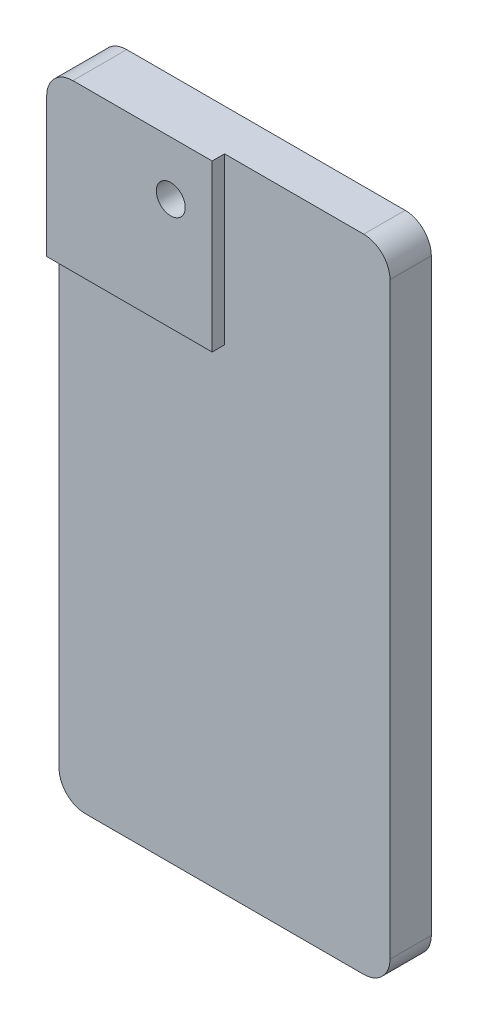
ISO-10303-21;
HEADER;
FILE_DESCRIPTION(('STEP AP214'),'2;1');
FILE_NAME('part.step','',(''),(''),'','','');
FILE_SCHEMA(('AUTOMOTIVE_DESIGN { 1 0 10303 214 1 1 1 1 }'));
ENDSEC;
DATA;
#1=APPLICATION_CONTEXT('core data for automotive mechanical design processes');
#2=APPLICATION_PROTOCOL_DEFINITION('international standard','automotive_design',2000,#1);
#3=PRODUCT_CONTEXT('',#1,'mechanical');
#4=PRODUCT('Part','Part','',(#3));
#5=PRODUCT_RELATED_PRODUCT_CATEGORY('part','',(#4));
#6=PRODUCT_DEFINITION_FORMATION('','',#4);
#7=PRODUCT_DEFINITION_CONTEXT('part definition',#1,'design');
#8=PRODUCT_DEFINITION('design','',#6,#7);
#9=PRODUCT_DEFINITION_SHAPE('','',#8);
#10=(LENGTH_UNIT() NAMED_UNIT(*) SI_UNIT(.MILLI.,.METRE.));
#11=(NAMED_UNIT(*) PLANE_ANGLE_UNIT() SI_UNIT($,.RADIAN.));
#12=(NAMED_UNIT(*) SI_UNIT($,.STERADIAN.) SOLID_ANGLE_UNIT());
#13=UNCERTAINTY_MEASURE_WITH_UNIT(LENGTH_MEASURE(1.E-05),#10,'distance_accuracy_value','');
#14=(GEOMETRIC_REPRESENTATION_CONTEXT(3) GLOBAL_UNCERTAINTY_ASSIGNED_CONTEXT((#13)) GLOBAL_UNIT_ASSIGNED_CONTEXT((#10,
#11,#12)) REPRESENTATION_CONTEXT('',''));
#15=CARTESIAN_POINT('',(0.,0.,0.));
#16=DIRECTION('',(0.,0.,1.));
#17=DIRECTION('',(1.,0.,0.));
#18=AXIS2_PLACEMENT_3D('',#15,#16,#17);
#19=CARTESIAN_POINT('',(40.,77.5,5.));
#20=DIRECTION('',(-1.,0.,0.));
#21=DIRECTION('',(0.,-1.,0.));
#22=AXIS2_PLACEMENT_3D('',#19,#20,#21);
#23=PLANE('',#22);
#24=DIRECTION('',(0.,1.,0.));
#25=VECTOR('',#24,1.);
#26=CARTESIAN_POINT('',(40.,77.5,5.));
#27=LINE('',#26,#25);
#28=CARTESIAN_POINT('',(40.,-71.15,5.));
#29=VERTEX_POINT('',#28);
#30=CARTESIAN_POINT('',(40.,71.15,5.));
#31=VERTEX_POINT('',#30);
#32=EDGE_CURVE('E165',#29,#31,#27,.T.);
#33=ORIENTED_EDGE('',*,*,#32,.F.);
#34=DIRECTION('',(0.,0.,-1.));
#35=VECTOR('',#34,1.);
#36=CARTESIAN_POINT('',(40.,-71.15,5.));
#37=LINE('',#36,#35);
#38=CARTESIAN_POINT('',(40.,-71.15,-5.));
#39=VERTEX_POINT('',#38);
#40=EDGE_CURVE('E190',#29,#39,#37,.T.);
#41=ORIENTED_EDGE('',*,*,#40,.T.);
#42=DIRECTION('',(0.,1.,0.));
#43=VECTOR('',#42,1.);
#44=CARTESIAN_POINT('',(40.,77.5,-5.));
#45=LINE('',#44,#43);
#46=CARTESIAN_POINT('',(40.,71.15,-5.));
#47=VERTEX_POINT('',#46);
#48=EDGE_CURVE('E154',#39,#47,#45,.T.);
#49=ORIENTED_EDGE('',*,*,#48,.T.);
#50=DIRECTION('',(0.,0.,-1.));
#51=VECTOR('',#50,1.);
#52=CARTESIAN_POINT('',(40.,71.15,5.));
#53=LINE('',#52,#51);
#54=EDGE_CURVE('E178',#47,#31,#53,.F.);
#55=ORIENTED_EDGE('',*,*,#54,.T.);
#56=EDGE_LOOP('',(#33,#41,#49,#55));
#57=FACE_BOUND('',#56,.T.);
#58=ADVANCED_FACE('F44',(#57),#23,.F.);
#59=CARTESIAN_POINT('',(-40.,77.5,5.));
#60=DIRECTION('',(0.,-1.,0.));
#61=DIRECTION('',(0.,0.,-1.));
#62=AXIS2_PLACEMENT_3D('',#59,#60,#61);
#63=PLANE('',#62);
#64=DIRECTION('',(-1.,0.,0.));
#65=VECTOR('',#64,1.);
#66=CARTESIAN_POINT('',(-40.,77.5,5.));
#67=LINE('',#66,#65);
#68=CARTESIAN_POINT('',(33.65,77.5,5.));
#69=VERTEX_POINT('',#68);
#70=CARTESIAN_POINT('',(0.,77.5,5.));
#71=VERTEX_POINT('',#70);
#72=EDGE_CURVE('E169',#69,#71,#67,.T.);
#73=ORIENTED_EDGE('',*,*,#72,.F.);
#74=DIRECTION('',(0.,0.,-1.));
#75=VECTOR('',#74,1.);
#76=CARTESIAN_POINT('',(33.65,77.5,5.));
#77=LINE('',#76,#75);
#78=CARTESIAN_POINT('',(33.65,77.5,-5.));
#79=VERTEX_POINT('',#78);
#80=EDGE_CURVE('E53',#69,#79,#77,.T.);
#81=ORIENTED_EDGE('',*,*,#80,.T.);
#82=DIRECTION('',(-1.,0.,0.));
#83=VECTOR('',#82,1.);
#84=CARTESIAN_POINT('',(-40.,77.5,-5.));
#85=LINE('',#84,#83);
#86=CARTESIAN_POINT('',(-33.65,77.5,-5.));
#87=VERTEX_POINT('',#86);
#88=EDGE_CURVE('E159',#79,#87,#85,.T.);
#89=ORIENTED_EDGE('',*,*,#88,.T.);
#90=DIRECTION('',(0.,0.,-1.));
#91=VECTOR('',#90,1.);
#92=CARTESIAN_POINT('',(-33.65,77.5,5.));
#93=LINE('',#92,#91);
#94=CARTESIAN_POINT('',(-33.65,77.5,8.));
#95=VERTEX_POINT('',#94);
#96=EDGE_CURVE('E60',#87,#95,#93,.F.);
#97=ORIENTED_EDGE('',*,*,#96,.T.);
#98=DIRECTION('',(-1.,0.,0.));
#99=VECTOR('',#98,1.);
#100=CARTESIAN_POINT('',(-40.,77.5,8.));
#101=LINE('',#100,#99);
#102=CARTESIAN_POINT('',(0.,77.5,8.));
#103=VERTEX_POINT('',#102);
#104=EDGE_CURVE('E270',#103,#95,#101,.T.);
#105=ORIENTED_EDGE('',*,*,#104,.F.);
#106=DIRECTION('',(0.,0.,-1.));
#107=VECTOR('',#106,1.);
#108=CARTESIAN_POINT('',(0.,77.5,8.));
#109=LINE('',#108,#107);
#110=EDGE_CURVE('E161',#103,#71,#109,.T.);
#111=ORIENTED_EDGE('',*,*,#110,.T.);
#112=EDGE_LOOP('',(#73,#81,#89,#97,#105,#111));
#113=FACE_BOUND('',#112,.T.);
#114=ADVANCED_FACE('F234',(#113),#63,.F.);
#115=CARTESIAN_POINT('',(-40.,77.5,5.));
#116=DIRECTION('',(1.,0.,0.));
#117=DIRECTION('',(0.,1.,0.));
#118=AXIS2_PLACEMENT_3D('',#115,#116,#117);
#119=PLANE('',#118);
#120=DIRECTION('',(0.,-1.,0.));
#121=VECTOR('',#120,1.);
#122=CARTESIAN_POINT('',(-40.,77.5,-5.));
#123=LINE('',#122,#121);
#124=CARTESIAN_POINT('',(-40.,71.15,-5.));
#125=VERTEX_POINT('',#124);
#126=CARTESIAN_POINT('',(-40.,-71.15,-5.));
#127=VERTEX_POINT('',#126);
#128=EDGE_CURVE('E182',#125,#127,#123,.T.);
#129=ORIENTED_EDGE('',*,*,#128,.T.);
#130=DIRECTION('',(0.,0.,-1.));
#131=VECTOR('',#130,1.);
#132=CARTESIAN_POINT('',(-40.,-71.15,5.));
#133=LINE('',#132,#131);
#134=CARTESIAN_POINT('',(-40.,-71.15,5.));
#135=VERTEX_POINT('',#134);
#136=EDGE_CURVE('E225',#127,#135,#133,.F.);
#137=ORIENTED_EDGE('',*,*,#136,.T.);
#138=DIRECTION('',(0.,-1.,0.));
#139=VECTOR('',#138,1.);
#140=CARTESIAN_POINT('',(-40.,77.5,5.));
#141=LINE('',#140,#139);
#142=CARTESIAN_POINT('',(-40.,37.5,5.));
#143=VERTEX_POINT('',#142);
#144=EDGE_CURVE('E152',#143,#135,#141,.T.);
#145=ORIENTED_EDGE('',*,*,#144,.F.);
#146=DIRECTION('',(0.,0.,-1.));
#147=VECTOR('',#146,1.);
#148=CARTESIAN_POINT('',(-40.,37.5,8.));
#149=LINE('',#148,#147);
#150=CARTESIAN_POINT('',(-40.,37.5,8.));
#151=VERTEX_POINT('',#150);
#152=EDGE_CURVE('E141',#151,#143,#149,.T.);
#153=ORIENTED_EDGE('',*,*,#152,.F.);
#154=DIRECTION('',(0.,-1.,0.));
#155=VECTOR('',#154,1.);
#156=CARTESIAN_POINT('',(-40.,77.5,8.));
#157=LINE('',#156,#155);
#158=CARTESIAN_POINT('',(-40.,71.15,8.));
#159=VERTEX_POINT('',#158);
#160=EDGE_CURVE('E125',#159,#151,#157,.T.);
#161=ORIENTED_EDGE('',*,*,#160,.F.);
#162=DIRECTION('',(0.,0.,-1.));
#163=VECTOR('',#162,1.);
#164=CARTESIAN_POINT('',(-40.,71.15,5.));
#165=LINE('',#164,#163);
#166=EDGE_CURVE('E222',#159,#125,#165,.T.);
#167=ORIENTED_EDGE('',*,*,#166,.T.);
#168=EDGE_LOOP('',(#129,#137,#145,#153,#161,#167));
#169=FACE_BOUND('',#168,.T.);
#170=ADVANCED_FACE('F150',(#169),#119,.F.);
#171=CARTESIAN_POINT('',(-40.,-77.5,5.));
#172=DIRECTION('',(0.,1.,0.));
#173=DIRECTION('',(0.,0.,1.));
#174=AXIS2_PLACEMENT_3D('',#171,#172,#173);
#175=PLANE('',#174);
#176=DIRECTION('',(1.,0.,0.));
#177=VECTOR('',#176,1.);
#178=CARTESIAN_POINT('',(-40.,-77.5,-5.));
#179=LINE('',#178,#177);
#180=CARTESIAN_POINT('',(-33.65,-77.5,-5.));
#181=VERTEX_POINT('',#180);
#182=CARTESIAN_POINT('',(33.65,-77.5,-5.));
#183=VERTEX_POINT('',#182);
#184=EDGE_CURVE('E170',#181,#183,#179,.T.);
#185=ORIENTED_EDGE('',*,*,#184,.T.);
#186=DIRECTION('',(0.,0.,-1.));
#187=VECTOR('',#186,1.);
#188=CARTESIAN_POINT('',(33.65,-77.5,5.));
#189=LINE('',#188,#187);
#190=CARTESIAN_POINT('',(33.65,-77.5,5.));
#191=VERTEX_POINT('',#190);
#192=EDGE_CURVE('E210',#183,#191,#189,.F.);
#193=ORIENTED_EDGE('',*,*,#192,.T.);
#194=DIRECTION('',(1.,0.,0.));
#195=VECTOR('',#194,1.);
#196=CARTESIAN_POINT('',(-40.,-77.5,5.));
#197=LINE('',#196,#195);
#198=CARTESIAN_POINT('',(-33.65,-77.5,5.));
#199=VERTEX_POINT('',#198);
#200=EDGE_CURVE('E175',#199,#191,#197,.T.);
#201=ORIENTED_EDGE('',*,*,#200,.F.);
#202=DIRECTION('',(0.,0.,-1.));
#203=VECTOR('',#202,1.);
#204=CARTESIAN_POINT('',(-33.65,-77.5,5.));
#205=LINE('',#204,#203);
#206=EDGE_CURVE('E206',#199,#181,#205,.T.);
#207=ORIENTED_EDGE('',*,*,#206,.T.);
#208=EDGE_LOOP('',(#185,#193,#201,#207));
#209=FACE_BOUND('',#208,.T.);
#210=ADVANCED_FACE('F253',(#209),#175,.F.);
#211=CARTESIAN_POINT('',(0.,0.,5.));
#212=DIRECTION('',(0.,0.,1.));
#213=DIRECTION('',(1.,0.,0.));
#214=AXIS2_PLACEMENT_3D('',#211,#212,#213);
#215=PLANE('',#214);
#216=ORIENTED_EDGE('',*,*,#200,.T.);
#217=CARTESIAN_POINT('',(33.65,-71.15,5.));
#218=DIRECTION('',(0.,0.,1.));
#219=DIRECTION('',(1.,0.,0.));
#220=AXIS2_PLACEMENT_3D('',#217,#218,#219);
#221=CIRCLE('',#220,6.35);
#222=EDGE_CURVE('E219',#191,#29,#221,.T.);
#223=ORIENTED_EDGE('',*,*,#222,.T.);
#224=ORIENTED_EDGE('',*,*,#32,.T.);
#225=CARTESIAN_POINT('',(33.65,71.15,5.));
#226=DIRECTION('',(0.,0.,1.));
#227=DIRECTION('',(1.,0.,0.));
#228=AXIS2_PLACEMENT_3D('',#225,#226,#227);
#229=CIRCLE('',#228,6.35);
#230=EDGE_CURVE('E213',#31,#69,#229,.T.);
#231=ORIENTED_EDGE('',*,*,#230,.T.);
#232=ORIENTED_EDGE('',*,*,#72,.T.);
#233=DIRECTION('',(0.,1.,0.));
#234=VECTOR('',#233,1.);
#235=CARTESIAN_POINT('',(0.,77.5,5.));
#236=LINE('',#235,#234);
#237=CARTESIAN_POINT('',(0.,37.5,5.));
#238=VERTEX_POINT('',#237);
#239=EDGE_CURVE('E135',#238,#71,#236,.T.);
#240=ORIENTED_EDGE('',*,*,#239,.F.);
#241=DIRECTION('',(1.,0.,0.));
#242=VECTOR('',#241,1.);
#243=CARTESIAN_POINT('',(-40.,37.5,5.));
#244=LINE('',#243,#242);
#245=EDGE_CURVE('E268',#143,#238,#244,.T.);
#246=ORIENTED_EDGE('',*,*,#245,.F.);
#247=ORIENTED_EDGE('',*,*,#144,.T.);
#248=CARTESIAN_POINT('',(-33.65,-71.15,5.));
#249=DIRECTION('',(0.,0.,1.));
#250=DIRECTION('',(1.,0.,0.));
#251=AXIS2_PLACEMENT_3D('',#248,#249,#250);
#252=CIRCLE('',#251,6.35);
#253=EDGE_CURVE('E216',#135,#199,#252,.T.);
#254=ORIENTED_EDGE('',*,*,#253,.T.);
#255=EDGE_LOOP('',(#216,#223,#224,#231,#232,#240,#246,#247,#254));
#256=FACE_BOUND('',#255,.T.);
#257=ADVANCED_FACE('F250',(#256),#215,.T.);
#258=CARTESIAN_POINT('',(0.,0.,-5.));
#259=DIRECTION('',(0.,0.,1.));
#260=DIRECTION('',(1.,0.,0.));
#261=AXIS2_PLACEMENT_3D('',#258,#259,#260);
#262=PLANE('',#261);
#263=CARTESIAN_POINT('',(-10.,64.5,-5.));
#264=DIRECTION('',(0.,0.,1.));
#265=DIRECTION('',(1.,0.,0.));
#266=AXIS2_PLACEMENT_3D('',#263,#264,#265);
#267=CIRCLE('',#266,3.5);
#268=CARTESIAN_POINT('',(-6.50000000000002,64.5,-5.));
#269=VERTEX_POINT('',#268);
#270=EDGE_CURVE('E276',#269,#269,#267,.T.);
#271=ORIENTED_EDGE('',*,*,#270,.T.);
#272=EDGE_LOOP('',(#271));
#273=FACE_BOUND('',#272,.T.);
#274=ORIENTED_EDGE('',*,*,#48,.F.);
#275=CARTESIAN_POINT('',(33.65,-71.15,-5.));
#276=DIRECTION('',(0.,0.,1.));
#277=DIRECTION('',(1.,0.,0.));
#278=AXIS2_PLACEMENT_3D('',#275,#276,#277);
#279=CIRCLE('',#278,6.35);
#280=EDGE_CURVE('E203',#39,#183,#279,.F.);
#281=ORIENTED_EDGE('',*,*,#280,.T.);
#282=ORIENTED_EDGE('',*,*,#184,.F.);
#283=CARTESIAN_POINT('',(-33.65,-71.15,-5.));
#284=DIRECTION('',(0.,0.,1.));
#285=DIRECTION('',(1.,0.,0.));
#286=AXIS2_PLACEMENT_3D('',#283,#284,#285);
#287=CIRCLE('',#286,6.35);
#288=EDGE_CURVE('E200',#181,#127,#287,.F.);
#289=ORIENTED_EDGE('',*,*,#288,.T.);
#290=ORIENTED_EDGE('',*,*,#128,.F.);
#291=CARTESIAN_POINT('',(-33.65,71.15,-5.));
#292=DIRECTION('',(0.,0.,1.));
#293=DIRECTION('',(1.,0.,0.));
#294=AXIS2_PLACEMENT_3D('',#291,#292,#293);
#295=CIRCLE('',#294,6.35);
#296=EDGE_CURVE('E194',#125,#87,#295,.F.);
#297=ORIENTED_EDGE('',*,*,#296,.T.);
#298=ORIENTED_EDGE('',*,*,#88,.F.);
#299=CARTESIAN_POINT('',(33.65,71.15,-5.));
#300=DIRECTION('',(0.,0.,1.));
#301=DIRECTION('',(1.,0.,0.));
#302=AXIS2_PLACEMENT_3D('',#299,#300,#301);
#303=CIRCLE('',#302,6.35);
#304=EDGE_CURVE('E197',#79,#47,#303,.F.);
#305=ORIENTED_EDGE('',*,*,#304,.T.);
#306=EDGE_LOOP('',(#274,#281,#282,#289,#290,#297,#298,#305));
#307=FACE_BOUND('',#306,.T.);
#308=ADVANCED_FACE('F240',(#273,#307),#262,.F.);
#309=CARTESIAN_POINT('',(-40.,37.5,8.));
#310=DIRECTION('',(0.,1.,0.));
#311=DIRECTION('',(0.,0.,1.));
#312=AXIS2_PLACEMENT_3D('',#309,#310,#311);
#313=PLANE('',#312);
#314=ORIENTED_EDGE('',*,*,#245,.T.);
#315=DIRECTION('',(0.,0.,-1.));
#316=VECTOR('',#315,1.);
#317=CARTESIAN_POINT('',(0.,37.5,8.));
#318=LINE('',#317,#316);
#319=CARTESIAN_POINT('',(0.,37.5,8.));
#320=VERTEX_POINT('',#319);
#321=EDGE_CURVE('E143',#320,#238,#318,.T.);
#322=ORIENTED_EDGE('',*,*,#321,.F.);
#323=DIRECTION('',(1.,0.,0.));
#324=VECTOR('',#323,1.);
#325=CARTESIAN_POINT('',(-40.,37.5,8.));
#326=LINE('',#325,#324);
#327=EDGE_CURVE('E128',#151,#320,#326,.T.);
#328=ORIENTED_EDGE('',*,*,#327,.F.);
#329=ORIENTED_EDGE('',*,*,#152,.T.);
#330=EDGE_LOOP('',(#314,#322,#328,#329));
#331=FACE_BOUND('',#330,.T.);
#332=ADVANCED_FACE('F140',(#331),#313,.F.);
#333=CARTESIAN_POINT('',(0.,77.5,8.));
#334=DIRECTION('',(-1.,0.,0.));
#335=DIRECTION('',(0.,-1.,0.));
#336=AXIS2_PLACEMENT_3D('',#333,#334,#335);
#337=PLANE('',#336);
#338=ORIENTED_EDGE('',*,*,#239,.T.);
#339=ORIENTED_EDGE('',*,*,#110,.F.);
#340=DIRECTION('',(0.,1.,0.));
#341=VECTOR('',#340,1.);
#342=CARTESIAN_POINT('',(0.,77.5,8.));
#343=LINE('',#342,#341);
#344=EDGE_CURVE('E146',#320,#103,#343,.T.);
#345=ORIENTED_EDGE('',*,*,#344,.F.);
#346=ORIENTED_EDGE('',*,*,#321,.T.);
#347=EDGE_LOOP('',(#338,#339,#345,#346));
#348=FACE_BOUND('',#347,.T.);
#349=ADVANCED_FACE('F266',(#348),#337,.F.);
#350=CARTESIAN_POINT('',(0.,0.,8.));
#351=DIRECTION('',(0.,0.,1.));
#352=DIRECTION('',(1.,0.,0.));
#353=AXIS2_PLACEMENT_3D('',#350,#351,#352);
#354=PLANE('',#353);
#355=CARTESIAN_POINT('',(-10.,64.5,8.));
#356=DIRECTION('',(0.,0.,1.));
#357=DIRECTION('',(1.,0.,0.));
#358=AXIS2_PLACEMENT_3D('',#355,#356,#357);
#359=CIRCLE('',#358,3.5);
#360=CARTESIAN_POINT('',(-6.50000000000002,64.5,8.));
#361=VERTEX_POINT('',#360);
#362=EDGE_CURVE('E280',#361,#361,#359,.T.);
#363=ORIENTED_EDGE('',*,*,#362,.F.);
#364=EDGE_LOOP('',(#363));
#365=FACE_BOUND('',#364,.T.);
#366=ORIENTED_EDGE('',*,*,#104,.T.);
#367=CARTESIAN_POINT('',(-33.65,71.15,8.));
#368=DIRECTION('',(0.,0.,1.));
#369=DIRECTION('',(1.,0.,0.));
#370=AXIS2_PLACEMENT_3D('',#367,#368,#369);
#371=CIRCLE('',#370,6.35);
#372=EDGE_CURVE('E11',#95,#159,#371,.T.);
#373=ORIENTED_EDGE('',*,*,#372,.T.);
#374=ORIENTED_EDGE('',*,*,#160,.T.);
#375=ORIENTED_EDGE('',*,*,#327,.T.);
#376=ORIENTED_EDGE('',*,*,#344,.T.);
#377=EDGE_LOOP('',(#366,#373,#374,#375,#376));
#378=FACE_BOUND('',#377,.T.);
#379=ADVANCED_FACE('F127',(#365,#378),#354,.T.);
#380=CARTESIAN_POINT('',(-10.,64.5,-5.));
#381=DIRECTION('',(0.,0.,1.));
#382=DIRECTION('',(1.,0.,0.));
#383=AXIS2_PLACEMENT_3D('',#380,#381,#382);
#384=CYLINDRICAL_SURFACE('',#383,3.5);
#385=ORIENTED_EDGE('',*,*,#270,.F.);
#386=EDGE_LOOP('',(#385));
#387=FACE_BOUND('',#386,.T.);
#388=ORIENTED_EDGE('',*,*,#362,.T.);
#389=EDGE_LOOP('',(#388));
#390=FACE_BOUND('',#389,.T.);
#391=ADVANCED_FACE('F289',(#387,#390),#384,.F.);
#392=CARTESIAN_POINT('',(33.65,-71.15,5.));
#393=DIRECTION('',(0.,0.,-1.));
#394=DIRECTION('',(-1.,0.,0.));
#395=AXIS2_PLACEMENT_3D('',#392,#393,#394);
#396=CYLINDRICAL_SURFACE('',#395,6.35);
#397=ORIENTED_EDGE('',*,*,#222,.F.);
#398=ORIENTED_EDGE('',*,*,#192,.F.);
#399=ORIENTED_EDGE('',*,*,#280,.F.);
#400=ORIENTED_EDGE('',*,*,#40,.F.);
#401=EDGE_LOOP('',(#397,#398,#399,#400));
#402=FACE_BOUND('',#401,.T.);
#403=ADVANCED_FACE('F257',(#402),#396,.T.);
#404=CARTESIAN_POINT('',(-33.65,-71.15,5.));
#405=DIRECTION('',(0.,0.,-1.));
#406=DIRECTION('',(-1.,0.,0.));
#407=AXIS2_PLACEMENT_3D('',#404,#405,#406);
#408=CYLINDRICAL_SURFACE('',#407,6.35);
#409=ORIENTED_EDGE('',*,*,#253,.F.);
#410=ORIENTED_EDGE('',*,*,#136,.F.);
#411=ORIENTED_EDGE('',*,*,#288,.F.);
#412=ORIENTED_EDGE('',*,*,#206,.F.);
#413=EDGE_LOOP('',(#409,#410,#411,#412));
#414=FACE_BOUND('',#413,.T.);
#415=ADVANCED_FACE('F246',(#414),#408,.T.);
#416=CARTESIAN_POINT('',(33.65,71.15,5.));
#417=DIRECTION('',(0.,0.,-1.));
#418=DIRECTION('',(-1.,0.,0.));
#419=AXIS2_PLACEMENT_3D('',#416,#417,#418);
#420=CYLINDRICAL_SURFACE('',#419,6.35);
#421=ORIENTED_EDGE('',*,*,#230,.F.);
#422=ORIENTED_EDGE('',*,*,#54,.F.);
#423=ORIENTED_EDGE('',*,*,#304,.F.);
#424=ORIENTED_EDGE('',*,*,#80,.F.);
#425=EDGE_LOOP('',(#421,#422,#423,#424));
#426=FACE_BOUND('',#425,.T.);
#427=ADVANCED_FACE('F262',(#426),#420,.T.);
#428=CARTESIAN_POINT('',(-33.65,71.15,5.));
#429=DIRECTION('',(0.,0.,-1.));
#430=DIRECTION('',(-1.,0.,0.));
#431=AXIS2_PLACEMENT_3D('',#428,#429,#430);
#432=CYLINDRICAL_SURFACE('',#431,6.35);
#433=ORIENTED_EDGE('',*,*,#372,.F.);
#434=ORIENTED_EDGE('',*,*,#96,.F.);
#435=ORIENTED_EDGE('',*,*,#296,.F.);
#436=ORIENTED_EDGE('',*,*,#166,.F.);
#437=EDGE_LOOP('',(#433,#434,#435,#436));
#438=FACE_BOUND('',#437,.T.);
#439=ADVANCED_FACE('F46',(#438),#432,.T.);
#440=CLOSED_SHELL('',(#58,#114,#170,#210,#257,#308,#332,#349,#379,#391,#403,#415,#427,#439));
#441=MANIFOLD_SOLID_BREP('B2',#440);
#442=ADVANCED_BREP_SHAPE_REPRESENTATION('',(#18,#441),#14);
#443=SHAPE_DEFINITION_REPRESENTATION(#9,#442);
ENDSEC;
END-ISO-10303-21;
